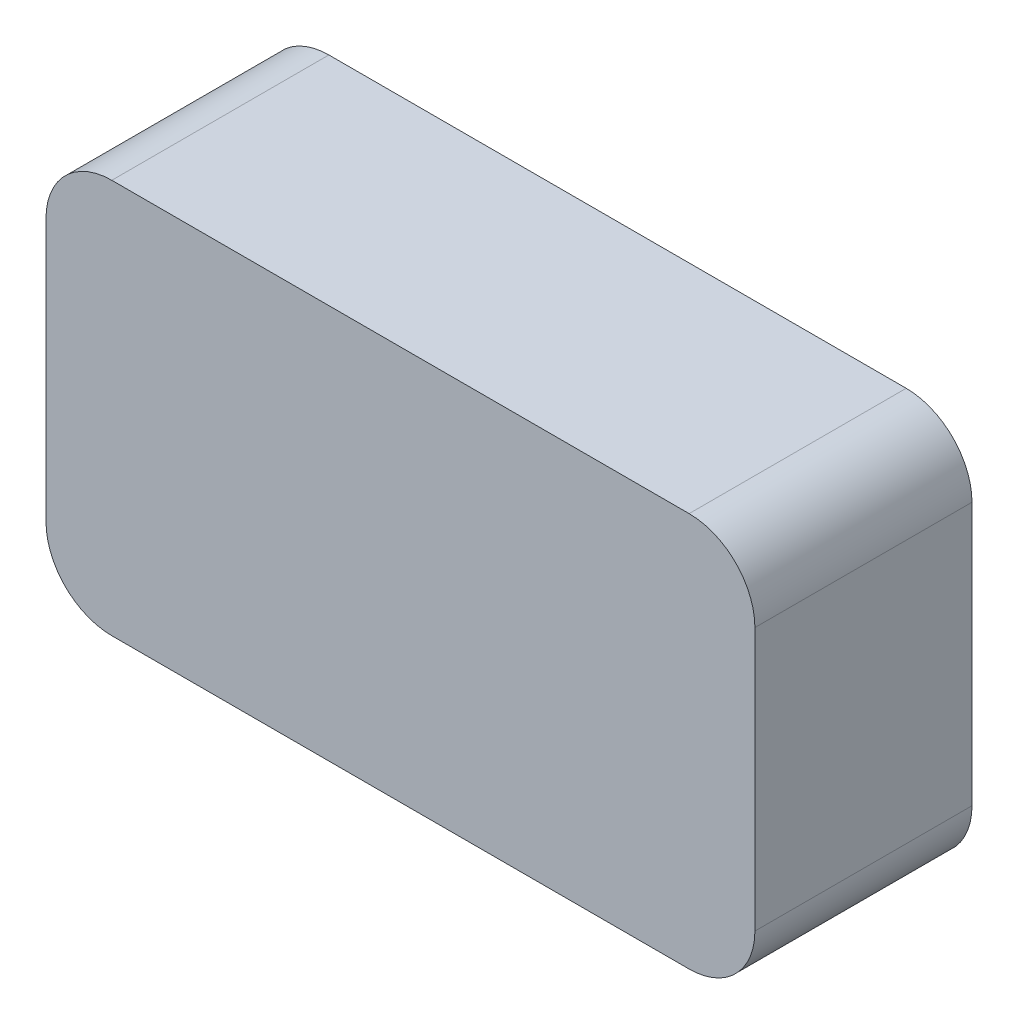
ISO-10303-21;
HEADER;
FILE_DESCRIPTION(('STEP AP214'),'2;1');
FILE_NAME('part.step','',(''),(''),'','','');
FILE_SCHEMA(('AUTOMOTIVE_DESIGN { 1 0 10303 214 1 1 1 1 }'));
ENDSEC;
DATA;
#1=APPLICATION_CONTEXT('core data for automotive mechanical design processes');
#2=APPLICATION_PROTOCOL_DEFINITION('international standard','automotive_design',2000,#1);
#3=PRODUCT_CONTEXT('',#1,'mechanical');
#4=PRODUCT('Part','Part','',(#3));
#5=PRODUCT_RELATED_PRODUCT_CATEGORY('part','',(#4));
#6=PRODUCT_DEFINITION_FORMATION('','',#4);
#7=PRODUCT_DEFINITION_CONTEXT('part definition',#1,'design');
#8=PRODUCT_DEFINITION('design','',#6,#7);
#9=PRODUCT_DEFINITION_SHAPE('','',#8);
#10=(LENGTH_UNIT() NAMED_UNIT(*) SI_UNIT(.MILLI.,.METRE.));
#11=(NAMED_UNIT(*) PLANE_ANGLE_UNIT() SI_UNIT($,.RADIAN.));
#12=(NAMED_UNIT(*) SI_UNIT($,.STERADIAN.) SOLID_ANGLE_UNIT());
#13=UNCERTAINTY_MEASURE_WITH_UNIT(LENGTH_MEASURE(1.E-05),#10,'distance_accuracy_value','');
#14=(GEOMETRIC_REPRESENTATION_CONTEXT(3) GLOBAL_UNCERTAINTY_ASSIGNED_CONTEXT((#13)) GLOBAL_UNIT_ASSIGNED_CONTEXT((#10,
#11,#12)) REPRESENTATION_CONTEXT('',''));
#15=CARTESIAN_POINT('',(0.,0.,0.));
#16=DIRECTION('',(0.,0.,1.));
#17=DIRECTION('',(1.,0.,0.));
#18=AXIS2_PLACEMENT_3D('',#15,#16,#17);
#19=CARTESIAN_POINT('',(-43.8823484434318,-19.9786595506348,33.));
#20=DIRECTION('',(0.,0.,1.));
#21=DIRECTION('',(1.,0.,0.));
#22=AXIS2_PLACEMENT_3D('',#19,#20,#21);
#23=CYLINDRICAL_SURFACE('',#22,10.);
#24=DIRECTION('',(0.,0.,1.));
#25=VECTOR('',#24,1.);
#26=CARTESIAN_POINT('',(-53.8823484434318,-19.9786595506348,33.));
#27=LINE('',#26,#25);
#28=CARTESIAN_POINT('',(-53.8823484434318,-19.9786595506348,0.));
#29=VERTEX_POINT('',#28);
#30=CARTESIAN_POINT('',(-53.8823484434318,-19.9786595506348,33.));
#31=VERTEX_POINT('',#30);
#32=EDGE_CURVE('E152',#29,#31,#27,.T.);
#33=ORIENTED_EDGE('',*,*,#32,.F.);
#34=CARTESIAN_POINT('',(-43.8823484434318,-19.9786595506348,0.));
#35=DIRECTION('',(0.,0.,1.));
#36=DIRECTION('',(1.,0.,0.));
#37=AXIS2_PLACEMENT_3D('',#34,#35,#36);
#38=CIRCLE('',#37,10.);
#39=CARTESIAN_POINT('',(-43.8823484434318,-29.9786595506348,0.));
#40=VERTEX_POINT('',#39);
#41=EDGE_CURVE('E55',#40,#29,#38,.F.);
#42=ORIENTED_EDGE('',*,*,#41,.F.);
#43=DIRECTION('',(0.,0.,1.));
#44=VECTOR('',#43,1.);
#45=CARTESIAN_POINT('',(-43.8823484434318,-29.9786595506348,33.));
#46=LINE('',#45,#44);
#47=CARTESIAN_POINT('',(-43.8823484434318,-29.9786595506348,33.));
#48=VERTEX_POINT('',#47);
#49=EDGE_CURVE('E155',#48,#40,#46,.F.);
#50=ORIENTED_EDGE('',*,*,#49,.F.);
#51=CARTESIAN_POINT('',(-43.8823484434318,-19.9786595506348,33.));
#52=DIRECTION('',(0.,0.,1.));
#53=DIRECTION('',(1.,0.,0.));
#54=AXIS2_PLACEMENT_3D('',#51,#52,#53);
#55=CIRCLE('',#54,10.);
#56=EDGE_CURVE('E42',#31,#48,#55,.T.);
#57=ORIENTED_EDGE('',*,*,#56,.F.);
#58=EDGE_LOOP('',(#33,#42,#50,#57));
#59=FACE_BOUND('',#58,.T.);
#60=ADVANCED_FACE('F35',(#59),#23,.T.);
#61=CARTESIAN_POINT('',(-43.8823484434318,19.9786595506348,33.));
#62=DIRECTION('',(0.,0.,-1.));
#63=DIRECTION('',(-1.,0.,0.));
#64=AXIS2_PLACEMENT_3D('',#61,#62,#63);
#65=CYLINDRICAL_SURFACE('',#64,10.);
#66=DIRECTION('',(0.,0.,-1.));
#67=VECTOR('',#66,1.);
#68=CARTESIAN_POINT('',(-53.8823484434318,19.9786595506348,33.));
#69=LINE('',#68,#67);
#70=CARTESIAN_POINT('',(-53.8823484434318,19.9786595506348,33.));
#71=VERTEX_POINT('',#70);
#72=CARTESIAN_POINT('',(-53.8823484434318,19.9786595506348,0.));
#73=VERTEX_POINT('',#72);
#74=EDGE_CURVE('E142',#71,#73,#69,.T.);
#75=ORIENTED_EDGE('',*,*,#74,.F.);
#76=CARTESIAN_POINT('',(-43.8823484434318,19.9786595506348,33.));
#77=DIRECTION('',(0.,0.,1.));
#78=DIRECTION('',(1.,0.,0.));
#79=AXIS2_PLACEMENT_3D('',#76,#77,#78);
#80=CIRCLE('',#79,10.);
#81=CARTESIAN_POINT('',(-43.8823484434318,29.9786595506348,33.));
#82=VERTEX_POINT('',#81);
#83=EDGE_CURVE('E148',#82,#71,#80,.T.);
#84=ORIENTED_EDGE('',*,*,#83,.F.);
#85=DIRECTION('',(0.,0.,-1.));
#86=VECTOR('',#85,1.);
#87=CARTESIAN_POINT('',(-43.8823484434318,29.9786595506348,33.));
#88=LINE('',#87,#86);
#89=CARTESIAN_POINT('',(-43.8823484434318,29.9786595506348,0.));
#90=VERTEX_POINT('',#89);
#91=EDGE_CURVE('E145',#90,#82,#88,.F.);
#92=ORIENTED_EDGE('',*,*,#91,.F.);
#93=CARTESIAN_POINT('',(-43.8823484434318,19.9786595506348,0.));
#94=DIRECTION('',(0.,0.,1.));
#95=DIRECTION('',(1.,0.,0.));
#96=AXIS2_PLACEMENT_3D('',#93,#94,#95);
#97=CIRCLE('',#96,10.);
#98=EDGE_CURVE('E150',#73,#90,#97,.F.);
#99=ORIENTED_EDGE('',*,*,#98,.F.);
#100=EDGE_LOOP('',(#75,#84,#92,#99));
#101=FACE_BOUND('',#100,.T.);
#102=ADVANCED_FACE('F195',(#101),#65,.T.);
#103=CARTESIAN_POINT('',(43.8823484434318,-19.9786595506348,33.));
#104=DIRECTION('',(0.,0.,1.));
#105=DIRECTION('',(1.,0.,0.));
#106=AXIS2_PLACEMENT_3D('',#103,#104,#105);
#107=CYLINDRICAL_SURFACE('',#106,10.);
#108=DIRECTION('',(0.,0.,1.));
#109=VECTOR('',#108,1.);
#110=CARTESIAN_POINT('',(43.8823484434318,-29.9786595506348,33.));
#111=LINE('',#110,#109);
#112=CARTESIAN_POINT('',(43.8823484434318,-29.9786595506348,0.));
#113=VERTEX_POINT('',#112);
#114=CARTESIAN_POINT('',(43.8823484434318,-29.9786595506348,33.));
#115=VERTEX_POINT('',#114);
#116=EDGE_CURVE('E134',#113,#115,#111,.T.);
#117=ORIENTED_EDGE('',*,*,#116,.F.);
#118=CARTESIAN_POINT('',(43.8823484434318,-19.9786595506348,0.));
#119=DIRECTION('',(0.,0.,1.));
#120=DIRECTION('',(1.,0.,0.));
#121=AXIS2_PLACEMENT_3D('',#118,#119,#120);
#122=CIRCLE('',#121,10.);
#123=CARTESIAN_POINT('',(53.8823484434318,-19.9786595506348,0.));
#124=VERTEX_POINT('',#123);
#125=EDGE_CURVE('E138',#124,#113,#122,.F.);
#126=ORIENTED_EDGE('',*,*,#125,.F.);
#127=DIRECTION('',(0.,0.,1.));
#128=VECTOR('',#127,1.);
#129=CARTESIAN_POINT('',(53.8823484434318,-19.9786595506348,33.));
#130=LINE('',#129,#128);
#131=CARTESIAN_POINT('',(53.8823484434318,-19.9786595506348,33.));
#132=VERTEX_POINT('',#131);
#133=EDGE_CURVE('E106',#132,#124,#130,.F.);
#134=ORIENTED_EDGE('',*,*,#133,.F.);
#135=CARTESIAN_POINT('',(43.8823484434318,-19.9786595506348,33.));
#136=DIRECTION('',(0.,0.,1.));
#137=DIRECTION('',(1.,0.,0.));
#138=AXIS2_PLACEMENT_3D('',#135,#136,#137);
#139=CIRCLE('',#138,10.);
#140=EDGE_CURVE('E140',#115,#132,#139,.T.);
#141=ORIENTED_EDGE('',*,*,#140,.F.);
#142=EDGE_LOOP('',(#117,#126,#134,#141));
#143=FACE_BOUND('',#142,.T.);
#144=ADVANCED_FACE('F183',(#143),#107,.T.);
#145=CARTESIAN_POINT('',(43.8823484434318,19.9786595506348,33.));
#146=DIRECTION('',(0.,0.,1.));
#147=DIRECTION('',(1.,0.,0.));
#148=AXIS2_PLACEMENT_3D('',#145,#146,#147);
#149=CYLINDRICAL_SURFACE('',#148,10.);
#150=DIRECTION('',(0.,0.,1.));
#151=VECTOR('',#150,1.);
#152=CARTESIAN_POINT('',(53.8823484434318,19.9786595506348,33.));
#153=LINE('',#152,#151);
#154=CARTESIAN_POINT('',(53.8823484434318,19.9786595506348,0.));
#155=VERTEX_POINT('',#154);
#156=CARTESIAN_POINT('',(53.8823484434318,19.9786595506348,33.));
#157=VERTEX_POINT('',#156);
#158=EDGE_CURVE('E104',#155,#157,#153,.T.);
#159=ORIENTED_EDGE('',*,*,#158,.F.);
#160=CARTESIAN_POINT('',(43.8823484434318,19.9786595506348,0.));
#161=DIRECTION('',(0.,0.,1.));
#162=DIRECTION('',(1.,0.,0.));
#163=AXIS2_PLACEMENT_3D('',#160,#161,#162);
#164=CIRCLE('',#163,10.);
#165=CARTESIAN_POINT('',(43.8823484434318,29.9786595506348,0.));
#166=VERTEX_POINT('',#165);
#167=EDGE_CURVE('E113',#166,#155,#164,.F.);
#168=ORIENTED_EDGE('',*,*,#167,.F.);
#169=DIRECTION('',(0.,0.,1.));
#170=VECTOR('',#169,1.);
#171=CARTESIAN_POINT('',(43.8823484434318,29.9786595506348,33.));
#172=LINE('',#171,#170);
#173=CARTESIAN_POINT('',(43.8823484434318,29.9786595506348,33.));
#174=VERTEX_POINT('',#173);
#175=EDGE_CURVE('E121',#174,#166,#172,.F.);
#176=ORIENTED_EDGE('',*,*,#175,.F.);
#177=CARTESIAN_POINT('',(43.8823484434318,19.9786595506348,33.));
#178=DIRECTION('',(0.,0.,1.));
#179=DIRECTION('',(1.,0.,0.));
#180=AXIS2_PLACEMENT_3D('',#177,#178,#179);
#181=CIRCLE('',#180,10.);
#182=EDGE_CURVE('E120',#157,#174,#181,.T.);
#183=ORIENTED_EDGE('',*,*,#182,.F.);
#184=EDGE_LOOP('',(#159,#168,#176,#183));
#185=FACE_BOUND('',#184,.T.);
#186=ADVANCED_FACE('F124',(#185),#149,.T.);
#187=CARTESIAN_POINT('',(-53.8823484434318,-29.9786595506348,33.));
#188=DIRECTION('',(1.,0.,0.));
#189=DIRECTION('',(0.,0.,-1.));
#190=AXIS2_PLACEMENT_3D('',#187,#188,#189);
#191=PLANE('',#190);
#192=DIRECTION('',(0.,-1.,0.));
#193=VECTOR('',#192,1.);
#194=CARTESIAN_POINT('',(-53.8823484434318,-29.9786595506348,0.));
#195=LINE('',#194,#193);
#196=EDGE_CURVE('E159',#73,#29,#195,.T.);
#197=ORIENTED_EDGE('',*,*,#196,.T.);
#198=ORIENTED_EDGE('',*,*,#32,.T.);
#199=DIRECTION('',(0.,-1.,0.));
#200=VECTOR('',#199,1.);
#201=CARTESIAN_POINT('',(-53.8823484434318,-29.9786595506348,33.));
#202=LINE('',#201,#200);
#203=EDGE_CURVE('E173',#71,#31,#202,.T.);
#204=ORIENTED_EDGE('',*,*,#203,.F.);
#205=ORIENTED_EDGE('',*,*,#74,.T.);
#206=EDGE_LOOP('',(#197,#198,#204,#205));
#207=FACE_BOUND('',#206,.T.);
#208=ADVANCED_FACE('F162',(#207),#191,.F.);
#209=CARTESIAN_POINT('',(53.8823484434318,-29.9786595506348,33.));
#210=DIRECTION('',(0.,1.,0.));
#211=DIRECTION('',(0.,0.,1.));
#212=AXIS2_PLACEMENT_3D('',#209,#210,#211);
#213=PLANE('',#212);
#214=DIRECTION('',(1.,0.,0.));
#215=VECTOR('',#214,1.);
#216=CARTESIAN_POINT('',(53.8823484434318,-29.9786595506348,33.));
#217=LINE('',#216,#215);
#218=EDGE_CURVE('E171',#48,#115,#217,.T.);
#219=ORIENTED_EDGE('',*,*,#218,.F.);
#220=ORIENTED_EDGE('',*,*,#49,.T.);
#221=DIRECTION('',(1.,0.,0.));
#222=VECTOR('',#221,1.);
#223=CARTESIAN_POINT('',(53.8823484434318,-29.9786595506348,0.));
#224=LINE('',#223,#222);
#225=EDGE_CURVE('E110',#40,#113,#224,.T.);
#226=ORIENTED_EDGE('',*,*,#225,.T.);
#227=ORIENTED_EDGE('',*,*,#116,.T.);
#228=EDGE_LOOP('',(#219,#220,#226,#227));
#229=FACE_BOUND('',#228,.T.);
#230=ADVANCED_FACE('F185',(#229),#213,.F.);
#231=CARTESIAN_POINT('',(53.8823484434318,-29.9786595506348,33.));
#232=DIRECTION('',(-1.,0.,0.));
#233=DIRECTION('',(0.,0.,1.));
#234=AXIS2_PLACEMENT_3D('',#231,#232,#233);
#235=PLANE('',#234);
#236=DIRECTION('',(0.,1.,0.));
#237=VECTOR('',#236,1.);
#238=CARTESIAN_POINT('',(53.8823484434318,-29.9786595506348,33.));
#239=LINE('',#238,#237);
#240=EDGE_CURVE('E129',#132,#157,#239,.T.);
#241=ORIENTED_EDGE('',*,*,#240,.F.);
#242=ORIENTED_EDGE('',*,*,#133,.T.);
#243=DIRECTION('',(0.,1.,0.));
#244=VECTOR('',#243,1.);
#245=CARTESIAN_POINT('',(53.8823484434318,-29.9786595506348,0.));
#246=LINE('',#245,#244);
#247=EDGE_CURVE('E99',#124,#155,#246,.T.);
#248=ORIENTED_EDGE('',*,*,#247,.T.);
#249=ORIENTED_EDGE('',*,*,#158,.T.);
#250=EDGE_LOOP('',(#241,#242,#248,#249));
#251=FACE_BOUND('',#250,.T.);
#252=ADVANCED_FACE('F102',(#251),#235,.F.);
#253=CARTESIAN_POINT('',(53.8823484434318,29.9786595506348,33.));
#254=DIRECTION('',(0.,-1.,0.));
#255=DIRECTION('',(0.,0.,-1.));
#256=AXIS2_PLACEMENT_3D('',#253,#254,#255);
#257=PLANE('',#256);
#258=DIRECTION('',(-1.,0.,0.));
#259=VECTOR('',#258,1.);
#260=CARTESIAN_POINT('',(53.8823484434318,29.9786595506348,0.));
#261=LINE('',#260,#259);
#262=EDGE_CURVE('E109',#166,#90,#261,.T.);
#263=ORIENTED_EDGE('',*,*,#262,.T.);
#264=ORIENTED_EDGE('',*,*,#91,.T.);
#265=DIRECTION('',(-1.,0.,0.));
#266=VECTOR('',#265,1.);
#267=CARTESIAN_POINT('',(53.8823484434318,29.9786595506348,33.));
#268=LINE('',#267,#266);
#269=EDGE_CURVE('E125',#174,#82,#268,.T.);
#270=ORIENTED_EDGE('',*,*,#269,.F.);
#271=ORIENTED_EDGE('',*,*,#175,.T.);
#272=EDGE_LOOP('',(#263,#264,#270,#271));
#273=FACE_BOUND('',#272,.T.);
#274=ADVANCED_FACE('F175',(#273),#257,.F.);
#275=CARTESIAN_POINT('',(0.,0.,33.));
#276=DIRECTION('',(0.,0.,1.));
#277=DIRECTION('',(1.,0.,0.));
#278=AXIS2_PLACEMENT_3D('',#275,#276,#277);
#279=PLANE('',#278);
#280=ORIENTED_EDGE('',*,*,#203,.T.);
#281=ORIENTED_EDGE('',*,*,#56,.T.);
#282=ORIENTED_EDGE('',*,*,#218,.T.);
#283=ORIENTED_EDGE('',*,*,#140,.T.);
#284=ORIENTED_EDGE('',*,*,#240,.T.);
#285=ORIENTED_EDGE('',*,*,#182,.T.);
#286=ORIENTED_EDGE('',*,*,#269,.T.);
#287=ORIENTED_EDGE('',*,*,#83,.T.);
#288=EDGE_LOOP('',(#280,#281,#282,#283,#284,#285,#286,#287));
#289=FACE_BOUND('',#288,.T.);
#290=ADVANCED_FACE('F178',(#289),#279,.T.);
#291=CARTESIAN_POINT('',(0.,0.,0.));
#292=DIRECTION('',(0.,0.,1.));
#293=DIRECTION('',(1.,0.,0.));
#294=AXIS2_PLACEMENT_3D('',#291,#292,#293);
#295=PLANE('',#294);
#296=CARTESIAN_POINT('',(36.1089310635937,0.,0.));
#297=DIRECTION('',(0.,0.,1.));
#298=DIRECTION('',(1.,0.,0.));
#299=AXIS2_PLACEMENT_3D('',#296,#297,#298);
#300=CIRCLE('',#299,2.5468681784667);
#301=CARTESIAN_POINT('',(38.6557992420604,0.,0.));
#302=VERTEX_POINT('',#301);
#303=EDGE_CURVE('E11',#302,#302,#300,.F.);
#304=ORIENTED_EDGE('',*,*,#303,.F.);
#305=EDGE_LOOP('',(#304));
#306=FACE_BOUND('',#305,.T.);
#307=ORIENTED_EDGE('',*,*,#225,.F.);
#308=ORIENTED_EDGE('',*,*,#41,.T.);
#309=ORIENTED_EDGE('',*,*,#196,.F.);
#310=ORIENTED_EDGE('',*,*,#98,.T.);
#311=ORIENTED_EDGE('',*,*,#262,.F.);
#312=ORIENTED_EDGE('',*,*,#167,.T.);
#313=ORIENTED_EDGE('',*,*,#247,.F.);
#314=ORIENTED_EDGE('',*,*,#125,.T.);
#315=EDGE_LOOP('',(#307,#308,#309,#310,#311,#312,#313,#314));
#316=FACE_BOUND('',#315,.T.);
#317=ADVANCED_FACE('F115',(#306,#316),#295,.F.);
#318=CARTESIAN_POINT('',(36.1089310635937,0.,-3.));
#319=DIRECTION('',(0.,0.,1.));
#320=DIRECTION('',(1.,0.,0.));
#321=AXIS2_PLACEMENT_3D('',#318,#319,#320);
#322=CYLINDRICAL_SURFACE('',#321,2.5468681784667);
#323=CARTESIAN_POINT('',(36.1089310635937,0.,-3.));
#324=DIRECTION('',(0.,0.,-1.));
#325=DIRECTION('',(-1.,0.,0.));
#326=AXIS2_PLACEMENT_3D('',#323,#324,#325);
#327=CIRCLE('',#326,2.5468681784667);
#328=CARTESIAN_POINT('',(33.562062885127,0.,-3.));
#329=VERTEX_POINT('',#328);
#330=EDGE_CURVE('E164',#329,#329,#327,.T.);
#331=ORIENTED_EDGE('',*,*,#330,.F.);
#332=EDGE_LOOP('',(#331));
#333=FACE_BOUND('',#332,.T.);
#334=ORIENTED_EDGE('',*,*,#303,.T.);
#335=EDGE_LOOP('',(#334));
#336=FACE_BOUND('',#335,.T.);
#337=ADVANCED_FACE('F241',(#333,#336),#322,.T.);
#338=CARTESIAN_POINT('',(36.1089310635937,0.,-3.));
#339=DIRECTION('',(0.,0.,-1.));
#340=DIRECTION('',(-1.,0.,0.));
#341=AXIS2_PLACEMENT_3D('',#338,#339,#340);
#342=PLANE('',#341);
#343=ORIENTED_EDGE('',*,*,#330,.T.);
#344=EDGE_LOOP('',(#343));
#345=FACE_BOUND('',#344,.T.);
#346=ADVANCED_FACE('F251',(#345),#342,.T.);
#347=CLOSED_SHELL('',(#60,#102,#144,#186,#208,#230,#252,#274,#290,#317,#337,#346));
#348=MANIFOLD_SOLID_BREP('B2',#347);
#349=ADVANCED_BREP_SHAPE_REPRESENTATION('',(#18,#348),#14);
#350=SHAPE_DEFINITION_REPRESENTATION(#9,#349);
ENDSEC;
END-ISO-10303-21;
